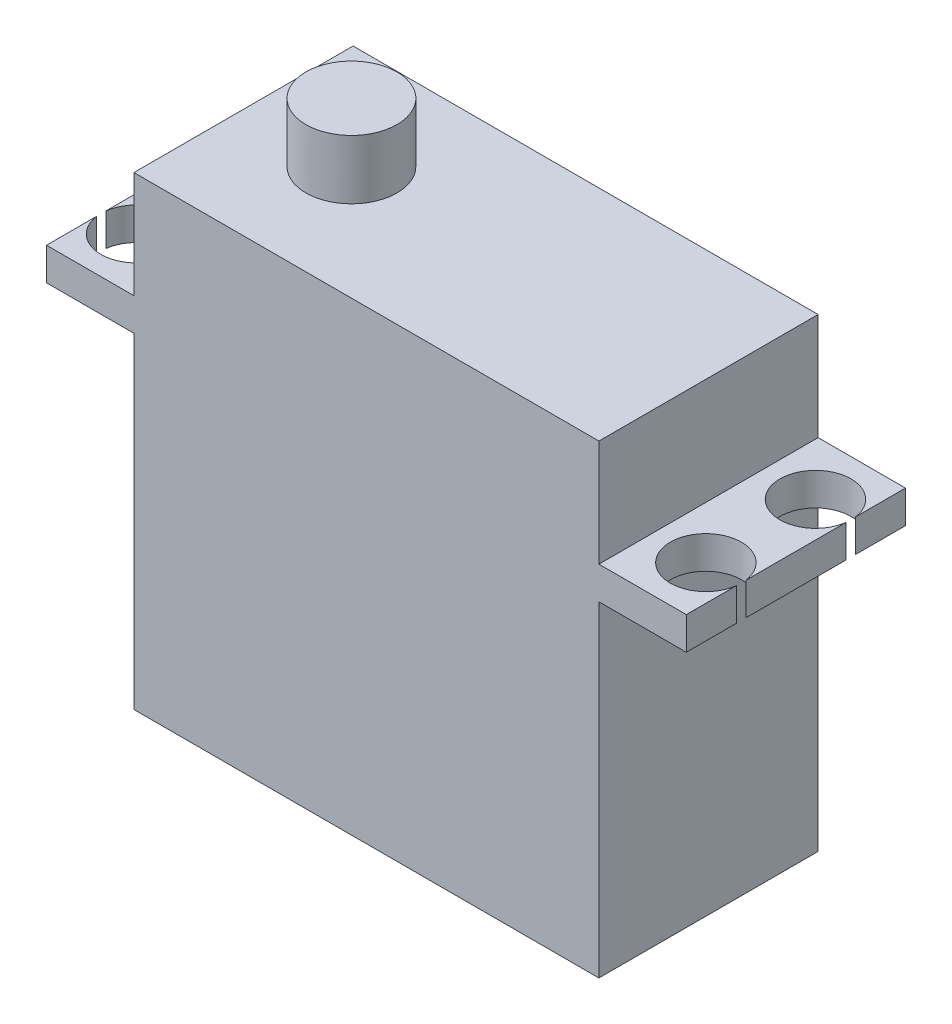
ISO-10303-21;
HEADER;
FILE_DESCRIPTION(('STEP AP214'),'2;1');
FILE_NAME('part.step','',(''),(''),'','','');
FILE_SCHEMA(('AUTOMOTIVE_DESIGN { 1 0 10303 214 1 1 1 1 }'));
ENDSEC;
DATA;
#1=APPLICATION_CONTEXT('core data for automotive mechanical design processes');
#2=APPLICATION_PROTOCOL_DEFINITION('international standard','automotive_design',2000,#1);
#3=PRODUCT_CONTEXT('',#1,'mechanical');
#4=PRODUCT('Part','Part','',(#3));
#5=PRODUCT_RELATED_PRODUCT_CATEGORY('part','',(#4));
#6=PRODUCT_DEFINITION_FORMATION('','',#4);
#7=PRODUCT_DEFINITION_CONTEXT('part definition',#1,'design');
#8=PRODUCT_DEFINITION('design','',#6,#7);
#9=PRODUCT_DEFINITION_SHAPE('','',#8);
#10=(LENGTH_UNIT() NAMED_UNIT(*) SI_UNIT(.MILLI.,.METRE.));
#11=(NAMED_UNIT(*) PLANE_ANGLE_UNIT() SI_UNIT($,.RADIAN.));
#12=(NAMED_UNIT(*) SI_UNIT($,.STERADIAN.) SOLID_ANGLE_UNIT());
#13=UNCERTAINTY_MEASURE_WITH_UNIT(LENGTH_MEASURE(1.E-05),#10,'distance_accuracy_value','');
#14=(GEOMETRIC_REPRESENTATION_CONTEXT(3) GLOBAL_UNCERTAINTY_ASSIGNED_CONTEXT((#13)) GLOBAL_UNIT_ASSIGNED_CONTEXT((#10,
#11,#12)) REPRESENTATION_CONTEXT('',''));
#15=CARTESIAN_POINT('',(0.,0.,0.));
#16=DIRECTION('',(0.,0.,1.));
#17=DIRECTION('',(1.,0.,0.));
#18=AXIS2_PLACEMENT_3D('',#15,#16,#17);
#19=CARTESIAN_POINT('',(-7.493,0.,0.));
#20=DIRECTION('',(1.,0.,0.));
#21=DIRECTION('',(0.,0.,-1.));
#22=AXIS2_PLACEMENT_3D('',#19,#20,#21);
#23=PLANE('',#22);
#24=DIRECTION('',(0.,0.,1.));
#25=VECTOR('',#24,1.);
#26=CARTESIAN_POINT('',(-7.493,27.94,-18.796));
#27=LINE('',#26,#25);
#28=CARTESIAN_POINT('',(-7.493,27.94,-13.6960559769363));
#29=VERTEX_POINT('',#28);
#30=CARTESIAN_POINT('',(-7.493,27.94,-5.09994402306369));
#31=VERTEX_POINT('',#30);
#32=EDGE_CURVE('E235',#29,#31,#27,.T.);
#33=ORIENTED_EDGE('',*,*,#32,.T.);
#34=DIRECTION('',(0.,1.,0.));
#35=VECTOR('',#34,1.);
#36=CARTESIAN_POINT('',(-7.493,25.654,-5.09994402306369));
#37=LINE('',#36,#35);
#38=CARTESIAN_POINT('',(-7.493,30.734,-5.09994402306369));
#39=VERTEX_POINT('',#38);
#40=EDGE_CURVE('E11',#31,#39,#37,.T.);
#41=ORIENTED_EDGE('',*,*,#40,.T.);
#42=DIRECTION('',(0.,0.,-1.));
#43=VECTOR('',#42,1.);
#44=CARTESIAN_POINT('',(-7.493,30.734,-18.796));
#45=LINE('',#44,#43);
#46=CARTESIAN_POINT('',(-7.493,30.734,-13.6960559769363));
#47=VERTEX_POINT('',#46);
#48=EDGE_CURVE('E242',#39,#47,#45,.T.);
#49=ORIENTED_EDGE('',*,*,#48,.T.);
#50=DIRECTION('',(0.,1.,0.));
#51=VECTOR('',#50,1.);
#52=CARTESIAN_POINT('',(-7.493,25.654,-13.6960559769363));
#53=LINE('',#52,#51);
#54=EDGE_CURVE('E301',#47,#29,#53,.F.);
#55=ORIENTED_EDGE('',*,*,#54,.T.);
#56=EDGE_LOOP('',(#33,#41,#49,#55));
#57=FACE_BOUND('',#56,.T.);
#58=ADVANCED_FACE('F36',(#57),#23,.F.);
#59=CARTESIAN_POINT('',(-7.493,27.94,-18.796));
#60=VERTEX_POINT('',#59);
#61=CARTESIAN_POINT('',(-7.493,27.94,-14.4979440230637));
#62=VERTEX_POINT('',#61);
#63=EDGE_CURVE('E231',#60,#62,#27,.T.);
#64=ORIENTED_EDGE('',*,*,#63,.T.);
#65=DIRECTION('',(0.,1.,0.));
#66=VECTOR('',#65,1.);
#67=CARTESIAN_POINT('',(-7.493,25.654,-14.4979440230637));
#68=LINE('',#67,#66);
#69=CARTESIAN_POINT('',(-7.493,30.734,-14.4979440230637));
#70=VERTEX_POINT('',#69);
#71=EDGE_CURVE('E303',#62,#70,#68,.T.);
#72=ORIENTED_EDGE('',*,*,#71,.T.);
#73=CARTESIAN_POINT('',(-7.493,30.734,-18.796));
#74=VERTEX_POINT('',#73);
#75=EDGE_CURVE('E237',#70,#74,#45,.T.);
#76=ORIENTED_EDGE('',*,*,#75,.T.);
#77=DIRECTION('',(0.,-1.,0.));
#78=VECTOR('',#77,1.);
#79=CARTESIAN_POINT('',(-7.493,27.94,-18.796));
#80=LINE('',#79,#78);
#81=EDGE_CURVE('E226',#74,#60,#80,.T.);
#82=ORIENTED_EDGE('',*,*,#81,.T.);
#83=EDGE_LOOP('',(#64,#72,#76,#82));
#84=FACE_BOUND('',#83,.T.);
#85=ADVANCED_FACE('F322',(#84),#23,.F.);
#86=CARTESIAN_POINT('',(47.371,0.,0.));
#87=DIRECTION('',(-1.,0.,0.));
#88=DIRECTION('',(0.,0.,1.));
#89=AXIS2_PLACEMENT_3D('',#86,#87,#88);
#90=PLANE('',#89);
#91=DIRECTION('',(0.,0.,-1.));
#92=VECTOR('',#91,1.);
#93=CARTESIAN_POINT('',(47.371,27.94,0.));
#94=LINE('',#93,#92);
#95=CARTESIAN_POINT('',(47.371,27.94,-5.09994402306371));
#96=VERTEX_POINT('',#95);
#97=CARTESIAN_POINT('',(47.371,27.94,-13.6960559769364));
#98=VERTEX_POINT('',#97);
#99=EDGE_CURVE('E355',#96,#98,#94,.T.);
#100=ORIENTED_EDGE('',*,*,#99,.T.);
#101=DIRECTION('',(0.,1.,0.));
#102=VECTOR('',#101,1.);
#103=CARTESIAN_POINT('',(47.371,25.654,-13.6960559769364));
#104=LINE('',#103,#102);
#105=CARTESIAN_POINT('',(47.371,30.734,-13.6960559769364));
#106=VERTEX_POINT('',#105);
#107=EDGE_CURVE('E298',#98,#106,#104,.T.);
#108=ORIENTED_EDGE('',*,*,#107,.T.);
#109=DIRECTION('',(0.,0.,1.));
#110=VECTOR('',#109,1.);
#111=CARTESIAN_POINT('',(47.371,30.734,0.));
#112=LINE('',#111,#110);
#113=CARTESIAN_POINT('',(47.371,30.734,-5.09994402306371));
#114=VERTEX_POINT('',#113);
#115=EDGE_CURVE('E200',#106,#114,#112,.T.);
#116=ORIENTED_EDGE('',*,*,#115,.T.);
#117=DIRECTION('',(0.,1.,0.));
#118=VECTOR('',#117,1.);
#119=CARTESIAN_POINT('',(47.371,25.654,-5.09994402306371));
#120=LINE('',#119,#118);
#121=EDGE_CURVE('E178',#114,#96,#120,.F.);
#122=ORIENTED_EDGE('',*,*,#121,.T.);
#123=EDGE_LOOP('',(#100,#108,#116,#122));
#124=FACE_BOUND('',#123,.T.);
#125=ADVANCED_FACE('F371',(#124),#90,.F.);
#126=CARTESIAN_POINT('',(47.371,27.94,0.));
#127=VERTEX_POINT('',#126);
#128=CARTESIAN_POINT('',(47.371,27.94,-4.29805597693635));
#129=VERTEX_POINT('',#128);
#130=EDGE_CURVE('E192',#127,#129,#94,.T.);
#131=ORIENTED_EDGE('',*,*,#130,.T.);
#132=DIRECTION('',(0.,1.,0.));
#133=VECTOR('',#132,1.);
#134=CARTESIAN_POINT('',(47.371,25.654,-4.29805597693635));
#135=LINE('',#134,#133);
#136=CARTESIAN_POINT('',(47.371,30.734,-4.29805597693635));
#137=VERTEX_POINT('',#136);
#138=EDGE_CURVE('E175',#129,#137,#135,.T.);
#139=ORIENTED_EDGE('',*,*,#138,.T.);
#140=CARTESIAN_POINT('',(47.371,30.734,0.));
#141=VERTEX_POINT('',#140);
#142=EDGE_CURVE('E190',#137,#141,#112,.T.);
#143=ORIENTED_EDGE('',*,*,#142,.T.);
#144=DIRECTION('',(0.,-1.,0.));
#145=VECTOR('',#144,1.);
#146=CARTESIAN_POINT('',(47.371,27.94,0.));
#147=LINE('',#146,#145);
#148=EDGE_CURVE('E352',#141,#127,#147,.T.);
#149=ORIENTED_EDGE('',*,*,#148,.T.);
#150=EDGE_LOOP('',(#131,#139,#143,#149));
#151=FACE_BOUND('',#150,.T.);
#152=ADVANCED_FACE('F188',(#151),#90,.F.);
#153=CARTESIAN_POINT('',(39.878,39.878,0.));
#154=DIRECTION('',(-1.,0.,0.));
#155=DIRECTION('',(0.,0.,1.));
#156=AXIS2_PLACEMENT_3D('',#153,#154,#155);
#157=PLANE('',#156);
#158=DIRECTION('',(0.,0.,1.));
#159=VECTOR('',#158,1.);
#160=CARTESIAN_POINT('',(39.878,30.734,0.));
#161=LINE('',#160,#159);
#162=CARTESIAN_POINT('',(39.878,30.734,-18.796));
#163=VERTEX_POINT('',#162);
#164=CARTESIAN_POINT('',(39.878,30.734,0.));
#165=VERTEX_POINT('',#164);
#166=EDGE_CURVE('E218',#163,#165,#161,.T.);
#167=ORIENTED_EDGE('',*,*,#166,.F.);
#168=DIRECTION('',(0.,-1.,0.));
#169=VECTOR('',#168,1.);
#170=CARTESIAN_POINT('',(39.878,39.878,-18.796));
#171=LINE('',#170,#169);
#172=CARTESIAN_POINT('',(39.878,39.878,-18.796));
#173=VERTEX_POINT('',#172);
#174=EDGE_CURVE('E283',#173,#163,#171,.T.);
#175=ORIENTED_EDGE('',*,*,#174,.F.);
#176=DIRECTION('',(0.,0.,-1.));
#177=VECTOR('',#176,1.);
#178=CARTESIAN_POINT('',(39.878,39.878,0.));
#179=LINE('',#178,#177);
#180=CARTESIAN_POINT('',(39.878,39.878,0.));
#181=VERTEX_POINT('',#180);
#182=EDGE_CURVE('E265',#181,#173,#179,.T.);
#183=ORIENTED_EDGE('',*,*,#182,.F.);
#184=DIRECTION('',(0.,-1.,0.));
#185=VECTOR('',#184,1.);
#186=CARTESIAN_POINT('',(39.878,39.878,0.));
#187=LINE('',#186,#185);
#188=EDGE_CURVE('E287',#181,#165,#187,.T.);
#189=ORIENTED_EDGE('',*,*,#188,.T.);
#190=EDGE_LOOP('',(#167,#175,#183,#189));
#191=FACE_BOUND('',#190,.T.);
#192=ADVANCED_FACE('F380',(#191),#157,.F.);
#193=DIRECTION('',(0.,0.,-1.));
#194=VECTOR('',#193,1.);
#195=CARTESIAN_POINT('',(39.878,27.94,0.));
#196=LINE('',#195,#194);
#197=CARTESIAN_POINT('',(39.878,27.94,0.));
#198=VERTEX_POINT('',#197);
#199=CARTESIAN_POINT('',(39.878,27.94,-18.796));
#200=VERTEX_POINT('',#199);
#201=EDGE_CURVE('E351',#198,#200,#196,.T.);
#202=ORIENTED_EDGE('',*,*,#201,.F.);
#203=CARTESIAN_POINT('',(39.878,0.,0.));
#204=VERTEX_POINT('',#203);
#205=EDGE_CURVE('E286',#198,#204,#187,.T.);
#206=ORIENTED_EDGE('',*,*,#205,.T.);
#207=DIRECTION('',(0.,0.,-1.));
#208=VECTOR('',#207,1.);
#209=CARTESIAN_POINT('',(39.878,0.,0.));
#210=LINE('',#209,#208);
#211=CARTESIAN_POINT('',(39.878,0.,-18.796));
#212=VERTEX_POINT('',#211);
#213=EDGE_CURVE('E275',#204,#212,#210,.T.);
#214=ORIENTED_EDGE('',*,*,#213,.T.);
#215=EDGE_CURVE('E282',#200,#212,#171,.T.);
#216=ORIENTED_EDGE('',*,*,#215,.F.);
#217=EDGE_LOOP('',(#202,#206,#214,#216));
#218=FACE_BOUND('',#217,.T.);
#219=ADVANCED_FACE('F377',(#218),#157,.F.);
#220=CARTESIAN_POINT('',(0.,39.878,0.));
#221=DIRECTION('',(1.,0.,0.));
#222=DIRECTION('',(0.,0.,-1.));
#223=AXIS2_PLACEMENT_3D('',#220,#221,#222);
#224=PLANE('',#223);
#225=DIRECTION('',(0.,0.,-1.));
#226=VECTOR('',#225,1.);
#227=CARTESIAN_POINT('',(0.,30.734,-18.796));
#228=LINE('',#227,#226);
#229=CARTESIAN_POINT('',(0.,30.734,0.));
#230=VERTEX_POINT('',#229);
#231=CARTESIAN_POINT('',(0.,30.734,-18.796));
#232=VERTEX_POINT('',#231);
#233=EDGE_CURVE('E230',#230,#232,#228,.T.);
#234=ORIENTED_EDGE('',*,*,#233,.F.);
#235=DIRECTION('',(0.,-1.,0.));
#236=VECTOR('',#235,1.);
#237=CARTESIAN_POINT('',(0.,39.878,0.));
#238=LINE('',#237,#236);
#239=CARTESIAN_POINT('',(0.,39.878,0.));
#240=VERTEX_POINT('',#239);
#241=EDGE_CURVE('E290',#240,#230,#238,.T.);
#242=ORIENTED_EDGE('',*,*,#241,.F.);
#243=DIRECTION('',(0.,0.,1.));
#244=VECTOR('',#243,1.);
#245=CARTESIAN_POINT('',(0.,39.878,0.));
#246=LINE('',#245,#244);
#247=CARTESIAN_POINT('',(0.,39.878,-18.796));
#248=VERTEX_POINT('',#247);
#249=EDGE_CURVE('E259',#248,#240,#246,.T.);
#250=ORIENTED_EDGE('',*,*,#249,.F.);
#251=DIRECTION('',(0.,-1.,0.));
#252=VECTOR('',#251,1.);
#253=CARTESIAN_POINT('',(0.,39.878,-18.796));
#254=LINE('',#253,#252);
#255=EDGE_CURVE('E280',#248,#232,#254,.T.);
#256=ORIENTED_EDGE('',*,*,#255,.T.);
#257=EDGE_LOOP('',(#234,#242,#250,#256));
#258=FACE_BOUND('',#257,.T.);
#259=ADVANCED_FACE('F38',(#258),#224,.F.);
#260=DIRECTION('',(0.,0.,1.));
#261=VECTOR('',#260,1.);
#262=CARTESIAN_POINT('',(0.,27.94,-18.796));
#263=LINE('',#262,#261);
#264=CARTESIAN_POINT('',(0.,27.94,-18.796));
#265=VERTEX_POINT('',#264);
#266=CARTESIAN_POINT('',(0.,27.94,0.));
#267=VERTEX_POINT('',#266);
#268=EDGE_CURVE('E225',#265,#267,#263,.T.);
#269=ORIENTED_EDGE('',*,*,#268,.F.);
#270=CARTESIAN_POINT('',(0.,0.,-18.796));
#271=VERTEX_POINT('',#270);
#272=EDGE_CURVE('E269',#265,#271,#254,.T.);
#273=ORIENTED_EDGE('',*,*,#272,.T.);
#274=DIRECTION('',(0.,0.,1.));
#275=VECTOR('',#274,1.);
#276=CARTESIAN_POINT('',(0.,0.,0.));
#277=LINE('',#276,#275);
#278=CARTESIAN_POINT('',(0.,0.,0.));
#279=VERTEX_POINT('',#278);
#280=EDGE_CURVE('E258',#271,#279,#277,.T.);
#281=ORIENTED_EDGE('',*,*,#280,.T.);
#282=EDGE_CURVE('E289',#267,#279,#238,.T.);
#283=ORIENTED_EDGE('',*,*,#282,.F.);
#284=EDGE_LOOP('',(#269,#273,#281,#283));
#285=FACE_BOUND('',#284,.T.);
#286=ADVANCED_FACE('F426',(#285),#224,.F.);
#287=CARTESIAN_POINT('',(0.,39.878,0.));
#288=DIRECTION('',(0.,0.,-1.));
#289=DIRECTION('',(-1.,0.,0.));
#290=AXIS2_PLACEMENT_3D('',#287,#288,#289);
#291=PLANE('',#290);
#292=DIRECTION('',(1.,0.,0.));
#293=VECTOR('',#292,1.);
#294=CARTESIAN_POINT('',(0.,0.,0.));
#295=LINE('',#294,#293);
#296=EDGE_CURVE('E272',#279,#204,#295,.T.);
#297=ORIENTED_EDGE('',*,*,#296,.T.);
#298=ORIENTED_EDGE('',*,*,#205,.F.);
#299=DIRECTION('',(-1.,0.,0.));
#300=VECTOR('',#299,1.);
#301=CARTESIAN_POINT('',(47.371,27.94,0.));
#302=LINE('',#301,#300);
#303=EDGE_CURVE('E222',#127,#198,#302,.T.);
#304=ORIENTED_EDGE('',*,*,#303,.F.);
#305=ORIENTED_EDGE('',*,*,#148,.F.);
#306=DIRECTION('',(-1.,0.,0.));
#307=VECTOR('',#306,1.);
#308=CARTESIAN_POINT('',(47.371,30.734,0.));
#309=LINE('',#308,#307);
#310=EDGE_CURVE('E198',#141,#165,#309,.T.);
#311=ORIENTED_EDGE('',*,*,#310,.T.);
#312=ORIENTED_EDGE('',*,*,#188,.F.);
#313=DIRECTION('',(1.,0.,0.));
#314=VECTOR('',#313,1.);
#315=CARTESIAN_POINT('',(0.,39.878,0.));
#316=LINE('',#315,#314);
#317=EDGE_CURVE('E262',#240,#181,#316,.T.);
#318=ORIENTED_EDGE('',*,*,#317,.F.);
#319=ORIENTED_EDGE('',*,*,#241,.T.);
#320=DIRECTION('',(1.,0.,0.));
#321=VECTOR('',#320,1.);
#322=CARTESIAN_POINT('',(-7.493,30.734,0.));
#323=LINE('',#322,#321);
#324=CARTESIAN_POINT('',(-7.493,30.734,0.));
#325=VERTEX_POINT('',#324);
#326=EDGE_CURVE('E249',#325,#230,#323,.T.);
#327=ORIENTED_EDGE('',*,*,#326,.F.);
#328=DIRECTION('',(0.,1.,0.));
#329=VECTOR('',#328,1.);
#330=CARTESIAN_POINT('',(-7.493,27.94,0.));
#331=LINE('',#330,#329);
#332=CARTESIAN_POINT('',(-7.493,27.94,0.));
#333=VERTEX_POINT('',#332);
#334=EDGE_CURVE('E234',#333,#325,#331,.T.);
#335=ORIENTED_EDGE('',*,*,#334,.F.);
#336=DIRECTION('',(1.,0.,0.));
#337=VECTOR('',#336,1.);
#338=CARTESIAN_POINT('',(-7.493,27.94,0.));
#339=LINE('',#338,#337);
#340=EDGE_CURVE('E252',#333,#267,#339,.T.);
#341=ORIENTED_EDGE('',*,*,#340,.T.);
#342=ORIENTED_EDGE('',*,*,#282,.T.);
#343=EDGE_LOOP('',(#297,#298,#304,#305,#311,#312,#318,#319,#327,#335,#341,#342));
#344=FACE_BOUND('',#343,.T.);
#345=ADVANCED_FACE('F331',(#344),#291,.F.);
#346=CARTESIAN_POINT('',(0.,39.878,-18.796));
#347=DIRECTION('',(0.,0.,1.));
#348=DIRECTION('',(1.,0.,0.));
#349=AXIS2_PLACEMENT_3D('',#346,#347,#348);
#350=PLANE('',#349);
#351=DIRECTION('',(-1.,0.,0.));
#352=VECTOR('',#351,1.);
#353=CARTESIAN_POINT('',(0.,0.,-18.796));
#354=LINE('',#353,#352);
#355=EDGE_CURVE('E263',#212,#271,#354,.T.);
#356=ORIENTED_EDGE('',*,*,#355,.T.);
#357=ORIENTED_EDGE('',*,*,#272,.F.);
#358=DIRECTION('',(1.,0.,0.));
#359=VECTOR('',#358,1.);
#360=CARTESIAN_POINT('',(-7.493,27.94,-18.796));
#361=LINE('',#360,#359);
#362=EDGE_CURVE('E255',#60,#265,#361,.T.);
#363=ORIENTED_EDGE('',*,*,#362,.F.);
#364=ORIENTED_EDGE('',*,*,#81,.F.);
#365=DIRECTION('',(1.,0.,0.));
#366=VECTOR('',#365,1.);
#367=CARTESIAN_POINT('',(-7.493,30.734,-18.796));
#368=LINE('',#367,#366);
#369=EDGE_CURVE('E241',#74,#232,#368,.T.);
#370=ORIENTED_EDGE('',*,*,#369,.T.);
#371=ORIENTED_EDGE('',*,*,#255,.F.);
#372=DIRECTION('',(-1.,0.,0.));
#373=VECTOR('',#372,1.);
#374=CARTESIAN_POINT('',(0.,39.878,-18.796));
#375=LINE('',#374,#373);
#376=EDGE_CURVE('E267',#173,#248,#375,.T.);
#377=ORIENTED_EDGE('',*,*,#376,.F.);
#378=ORIENTED_EDGE('',*,*,#174,.T.);
#379=DIRECTION('',(-1.,0.,0.));
#380=VECTOR('',#379,1.);
#381=CARTESIAN_POINT('',(47.371,30.734,-18.796));
#382=LINE('',#381,#380);
#383=CARTESIAN_POINT('',(47.371,30.734,-18.796));
#384=VERTEX_POINT('',#383);
#385=EDGE_CURVE('E210',#384,#163,#382,.T.);
#386=ORIENTED_EDGE('',*,*,#385,.F.);
#387=DIRECTION('',(0.,1.,0.));
#388=VECTOR('',#387,1.);
#389=CARTESIAN_POINT('',(47.371,27.94,-18.796));
#390=LINE('',#389,#388);
#391=CARTESIAN_POINT('',(47.371,27.94,-18.796));
#392=VERTEX_POINT('',#391);
#393=EDGE_CURVE('E201',#392,#384,#390,.T.);
#394=ORIENTED_EDGE('',*,*,#393,.F.);
#395=DIRECTION('',(-1.,0.,0.));
#396=VECTOR('',#395,1.);
#397=CARTESIAN_POINT('',(47.371,27.94,-18.796));
#398=LINE('',#397,#396);
#399=EDGE_CURVE('E215',#392,#200,#398,.T.);
#400=ORIENTED_EDGE('',*,*,#399,.T.);
#401=ORIENTED_EDGE('',*,*,#215,.T.);
#402=EDGE_LOOP('',(#356,#357,#363,#364,#370,#371,#377,#378,#386,#394,#400,#401));
#403=FACE_BOUND('',#402,.T.);
#404=ADVANCED_FACE('F329',(#403),#350,.F.);
#405=CARTESIAN_POINT('',(0.,39.878,0.));
#406=DIRECTION('',(0.,-1.,0.));
#407=DIRECTION('',(0.,0.,-1.));
#408=AXIS2_PLACEMENT_3D('',#405,#406,#407);
#409=PLANE('',#408);
#410=CARTESIAN_POINT('',(8.89,39.878,-9.7647570607622));
#411=DIRECTION('',(0.,-1.,0.));
#412=DIRECTION('',(0.,0.,-1.));
#413=AXIS2_PLACEMENT_3D('',#410,#411,#412);
#414=CIRCLE('',#413,3.90808302264822);
#415=CARTESIAN_POINT('',(8.89,39.878,-13.6728400834104));
#416=VERTEX_POINT('',#415);
#417=EDGE_CURVE('E293',#416,#416,#414,.F.);
#418=ORIENTED_EDGE('',*,*,#417,.F.);
#419=EDGE_LOOP('',(#418));
#420=FACE_BOUND('',#419,.T.);
#421=ORIENTED_EDGE('',*,*,#249,.T.);
#422=ORIENTED_EDGE('',*,*,#317,.T.);
#423=ORIENTED_EDGE('',*,*,#182,.T.);
#424=ORIENTED_EDGE('',*,*,#376,.T.);
#425=EDGE_LOOP('',(#421,#422,#423,#424));
#426=FACE_BOUND('',#425,.T.);
#427=ADVANCED_FACE('F384',(#420,#426),#409,.F.);
#428=CARTESIAN_POINT('',(0.,0.,0.));
#429=DIRECTION('',(0.,-1.,0.));
#430=DIRECTION('',(0.,0.,-1.));
#431=AXIS2_PLACEMENT_3D('',#428,#429,#430);
#432=PLANE('',#431);
#433=ORIENTED_EDGE('',*,*,#280,.F.);
#434=ORIENTED_EDGE('',*,*,#355,.F.);
#435=ORIENTED_EDGE('',*,*,#213,.F.);
#436=ORIENTED_EDGE('',*,*,#296,.F.);
#437=EDGE_LOOP('',(#433,#434,#435,#436));
#438=FACE_BOUND('',#437,.T.);
#439=ADVANCED_FACE('F413',(#438),#432,.T.);
#440=CARTESIAN_POINT('',(-7.493,27.94,-18.796));
#441=DIRECTION('',(0.,1.,0.));
#442=DIRECTION('',(0.,0.,1.));
#443=AXIS2_PLACEMENT_3D('',#440,#441,#442);
#444=PLANE('',#443);
#445=CARTESIAN_POINT('',(-7.493,27.94,-4.29805597693631));
#446=VERTEX_POINT('',#445);
#447=EDGE_CURVE('E229',#446,#333,#27,.T.);
#448=ORIENTED_EDGE('',*,*,#447,.F.);
#449=CARTESIAN_POINT('',(-4.4714858282031,27.94,-4.699));
#450=DIRECTION('',(0.,1.,0.));
#451=DIRECTION('',(0.,0.,1.));
#452=AXIS2_PLACEMENT_3D('',#449,#450,#451);
#453=CIRCLE('',#452,3.048);
#454=EDGE_CURVE('E51',#446,#31,#453,.T.);
#455=ORIENTED_EDGE('',*,*,#454,.T.);
#456=ORIENTED_EDGE('',*,*,#32,.F.);
#457=CARTESIAN_POINT('',(-4.4714858282031,27.94,-14.097));
#458=DIRECTION('',(0.,1.,0.));
#459=DIRECTION('',(0.,0.,1.));
#460=AXIS2_PLACEMENT_3D('',#457,#458,#459);
#461=CIRCLE('',#460,3.048);
#462=EDGE_CURVE('E59',#29,#62,#461,.T.);
#463=ORIENTED_EDGE('',*,*,#462,.T.);
#464=ORIENTED_EDGE('',*,*,#63,.F.);
#465=ORIENTED_EDGE('',*,*,#362,.T.);
#466=ORIENTED_EDGE('',*,*,#268,.T.);
#467=ORIENTED_EDGE('',*,*,#340,.F.);
#468=EDGE_LOOP('',(#448,#455,#456,#463,#464,#465,#466,#467));
#469=FACE_BOUND('',#468,.T.);
#470=ADVANCED_FACE('F312',(#469),#444,.F.);
#471=CARTESIAN_POINT('',(-7.493,30.734,-18.796));
#472=DIRECTION('',(0.,-1.,0.));
#473=DIRECTION('',(0.,0.,-1.));
#474=AXIS2_PLACEMENT_3D('',#471,#472,#473);
#475=PLANE('',#474);
#476=ORIENTED_EDGE('',*,*,#48,.F.);
#477=CARTESIAN_POINT('',(-4.4714858282031,30.734,-4.699));
#478=DIRECTION('',(0.,1.,0.));
#479=DIRECTION('',(0.,0.,-1.));
#480=AXIS2_PLACEMENT_3D('',#477,#478,#479);
#481=CIRCLE('',#480,3.048);
#482=CARTESIAN_POINT('',(-7.493,30.734,-4.29805597693631));
#483=VERTEX_POINT('',#482);
#484=EDGE_CURVE('E183',#483,#39,#481,.T.);
#485=ORIENTED_EDGE('',*,*,#484,.F.);
#486=EDGE_CURVE('E238',#325,#483,#45,.T.);
#487=ORIENTED_EDGE('',*,*,#486,.F.);
#488=ORIENTED_EDGE('',*,*,#326,.T.);
#489=ORIENTED_EDGE('',*,*,#233,.T.);
#490=ORIENTED_EDGE('',*,*,#369,.F.);
#491=ORIENTED_EDGE('',*,*,#75,.F.);
#492=CARTESIAN_POINT('',(-4.4714858282031,30.734,-14.097));
#493=DIRECTION('',(0.,1.,0.));
#494=DIRECTION('',(0.,0.,1.));
#495=AXIS2_PLACEMENT_3D('',#492,#493,#494);
#496=CIRCLE('',#495,3.048);
#497=EDGE_CURVE('E338',#47,#70,#496,.T.);
#498=ORIENTED_EDGE('',*,*,#497,.F.);
#499=EDGE_LOOP('',(#476,#485,#487,#488,#489,#490,#491,#498));
#500=FACE_BOUND('',#499,.T.);
#501=ADVANCED_FACE('F336',(#500),#475,.F.);
#502=ORIENTED_EDGE('',*,*,#486,.T.);
#503=DIRECTION('',(0.,1.,0.));
#504=VECTOR('',#503,1.);
#505=CARTESIAN_POINT('',(-7.493,25.654,-4.29805597693631));
#506=LINE('',#505,#504);
#507=EDGE_CURVE('E44',#483,#446,#506,.F.);
#508=ORIENTED_EDGE('',*,*,#507,.T.);
#509=ORIENTED_EDGE('',*,*,#447,.T.);
#510=ORIENTED_EDGE('',*,*,#334,.T.);
#511=EDGE_LOOP('',(#502,#508,#509,#510));
#512=FACE_BOUND('',#511,.T.);
#513=ADVANCED_FACE('F307',(#512),#23,.F.);
#514=CARTESIAN_POINT('',(47.371,27.94,0.));
#515=DIRECTION('',(0.,1.,0.));
#516=DIRECTION('',(0.,0.,1.));
#517=AXIS2_PLACEMENT_3D('',#514,#515,#516);
#518=PLANE('',#517);
#519=CARTESIAN_POINT('',(47.371,27.94,-14.4979440230636));
#520=VERTEX_POINT('',#519);
#521=EDGE_CURVE('E354',#520,#392,#94,.T.);
#522=ORIENTED_EDGE('',*,*,#521,.F.);
#523=CARTESIAN_POINT('',(44.3494858282031,27.94,-14.097));
#524=DIRECTION('',(0.,1.,0.));
#525=DIRECTION('',(0.,0.,1.));
#526=AXIS2_PLACEMENT_3D('',#523,#524,#525);
#527=CIRCLE('',#526,3.048);
#528=EDGE_CURVE('E319',#520,#98,#527,.T.);
#529=ORIENTED_EDGE('',*,*,#528,.T.);
#530=ORIENTED_EDGE('',*,*,#99,.F.);
#531=CARTESIAN_POINT('',(44.3494858282031,27.94,-4.69900000000003));
#532=DIRECTION('',(0.,1.,0.));
#533=DIRECTION('',(0.,0.,1.));
#534=AXIS2_PLACEMENT_3D('',#531,#532,#533);
#535=CIRCLE('',#534,3.048);
#536=EDGE_CURVE('E340',#96,#129,#535,.T.);
#537=ORIENTED_EDGE('',*,*,#536,.T.);
#538=ORIENTED_EDGE('',*,*,#130,.F.);
#539=ORIENTED_EDGE('',*,*,#303,.T.);
#540=ORIENTED_EDGE('',*,*,#201,.T.);
#541=ORIENTED_EDGE('',*,*,#399,.F.);
#542=EDGE_LOOP('',(#522,#529,#530,#537,#538,#539,#540,#541));
#543=FACE_BOUND('',#542,.T.);
#544=ADVANCED_FACE('F364',(#543),#518,.F.);
#545=CARTESIAN_POINT('',(47.371,30.734,0.));
#546=DIRECTION('',(0.,-1.,0.));
#547=DIRECTION('',(0.,0.,-1.));
#548=AXIS2_PLACEMENT_3D('',#545,#546,#547);
#549=PLANE('',#548);
#550=ORIENTED_EDGE('',*,*,#115,.F.);
#551=CARTESIAN_POINT('',(44.3494858282031,30.734,-14.097));
#552=DIRECTION('',(0.,1.,0.));
#553=DIRECTION('',(0.,0.,-1.));
#554=AXIS2_PLACEMENT_3D('',#551,#552,#553);
#555=CIRCLE('',#554,3.048);
#556=CARTESIAN_POINT('',(47.371,30.734,-14.4979440230636));
#557=VERTEX_POINT('',#556);
#558=EDGE_CURVE('E184',#557,#106,#555,.T.);
#559=ORIENTED_EDGE('',*,*,#558,.F.);
#560=EDGE_CURVE('E203',#384,#557,#112,.T.);
#561=ORIENTED_EDGE('',*,*,#560,.F.);
#562=ORIENTED_EDGE('',*,*,#385,.T.);
#563=ORIENTED_EDGE('',*,*,#166,.T.);
#564=ORIENTED_EDGE('',*,*,#310,.F.);
#565=ORIENTED_EDGE('',*,*,#142,.F.);
#566=CARTESIAN_POINT('',(44.3494858282031,30.734,-4.69900000000003));
#567=DIRECTION('',(0.,1.,0.));
#568=DIRECTION('',(0.,0.,1.));
#569=AXIS2_PLACEMENT_3D('',#566,#567,#568);
#570=CIRCLE('',#569,3.048);
#571=EDGE_CURVE('E172',#114,#137,#570,.T.);
#572=ORIENTED_EDGE('',*,*,#571,.F.);
#573=EDGE_LOOP('',(#550,#559,#561,#562,#563,#564,#565,#572));
#574=FACE_BOUND('',#573,.T.);
#575=ADVANCED_FACE('F195',(#574),#549,.F.);
#576=ORIENTED_EDGE('',*,*,#560,.T.);
#577=DIRECTION('',(0.,1.,0.));
#578=VECTOR('',#577,1.);
#579=CARTESIAN_POINT('',(47.371,25.654,-14.4979440230636));
#580=LINE('',#579,#578);
#581=EDGE_CURVE('E193',#557,#520,#580,.F.);
#582=ORIENTED_EDGE('',*,*,#581,.T.);
#583=ORIENTED_EDGE('',*,*,#521,.T.);
#584=ORIENTED_EDGE('',*,*,#393,.T.);
#585=EDGE_LOOP('',(#576,#582,#583,#584));
#586=FACE_BOUND('',#585,.T.);
#587=ADVANCED_FACE('F359',(#586),#90,.F.);
#588=CARTESIAN_POINT('',(8.89,44.958,-9.7647570607622));
#589=DIRECTION('',(0.,-1.,0.));
#590=DIRECTION('',(0.,0.,-1.));
#591=AXIS2_PLACEMENT_3D('',#588,#589,#590);
#592=CYLINDRICAL_SURFACE('',#591,3.90808302264822);
#593=CARTESIAN_POINT('',(8.89,44.958,-9.7647570607622));
#594=DIRECTION('',(0.,1.,0.));
#595=DIRECTION('',(0.,0.,1.));
#596=AXIS2_PLACEMENT_3D('',#593,#594,#595);
#597=CIRCLE('',#596,3.90808302264822);
#598=CARTESIAN_POINT('',(8.89,44.958,-5.85667403811398));
#599=VERTEX_POINT('',#598);
#600=EDGE_CURVE('E348',#599,#599,#597,.T.);
#601=ORIENTED_EDGE('',*,*,#600,.F.);
#602=EDGE_LOOP('',(#601));
#603=FACE_BOUND('',#602,.T.);
#604=ORIENTED_EDGE('',*,*,#417,.T.);
#605=EDGE_LOOP('',(#604));
#606=FACE_BOUND('',#605,.T.);
#607=ADVANCED_FACE('F473',(#603,#606),#592,.T.);
#608=CARTESIAN_POINT('',(8.89,44.958,-9.7647570607622));
#609=DIRECTION('',(0.,1.,0.));
#610=DIRECTION('',(0.,0.,1.));
#611=AXIS2_PLACEMENT_3D('',#608,#609,#610);
#612=PLANE('',#611);
#613=ORIENTED_EDGE('',*,*,#600,.T.);
#614=EDGE_LOOP('',(#613));
#615=FACE_BOUND('',#614,.T.);
#616=ADVANCED_FACE('F468',(#615),#612,.T.);
#617=CARTESIAN_POINT('',(44.3494858282031,25.654,-4.69900000000003));
#618=DIRECTION('',(0.,1.,0.));
#619=DIRECTION('',(0.,0.,1.));
#620=AXIS2_PLACEMENT_3D('',#617,#618,#619);
#621=CYLINDRICAL_SURFACE('',#620,3.048);
#622=ORIENTED_EDGE('',*,*,#536,.F.);
#623=ORIENTED_EDGE('',*,*,#121,.F.);
#624=ORIENTED_EDGE('',*,*,#571,.T.);
#625=ORIENTED_EDGE('',*,*,#138,.F.);
#626=EDGE_LOOP('',(#622,#623,#624,#625));
#627=FACE_BOUND('',#626,.T.);
#628=ADVANCED_FACE('F174',(#627),#621,.F.);
#629=CARTESIAN_POINT('',(44.3494858282031,25.654,-14.097));
#630=DIRECTION('',(0.,1.,0.));
#631=DIRECTION('',(0.,0.,1.));
#632=AXIS2_PLACEMENT_3D('',#629,#630,#631);
#633=CYLINDRICAL_SURFACE('',#632,3.048);
#634=ORIENTED_EDGE('',*,*,#528,.F.);
#635=ORIENTED_EDGE('',*,*,#581,.F.);
#636=ORIENTED_EDGE('',*,*,#558,.T.);
#637=ORIENTED_EDGE('',*,*,#107,.F.);
#638=EDGE_LOOP('',(#634,#635,#636,#637));
#639=FACE_BOUND('',#638,.T.);
#640=ADVANCED_FACE('F369',(#639),#633,.F.);
#641=CARTESIAN_POINT('',(-4.4714858282031,25.654,-14.097));
#642=DIRECTION('',(0.,1.,0.));
#643=DIRECTION('',(0.,0.,1.));
#644=AXIS2_PLACEMENT_3D('',#641,#642,#643);
#645=CYLINDRICAL_SURFACE('',#644,3.048);
#646=ORIENTED_EDGE('',*,*,#462,.F.);
#647=ORIENTED_EDGE('',*,*,#54,.F.);
#648=ORIENTED_EDGE('',*,*,#497,.T.);
#649=ORIENTED_EDGE('',*,*,#71,.F.);
#650=EDGE_LOOP('',(#646,#647,#648,#649));
#651=FACE_BOUND('',#650,.T.);
#652=ADVANCED_FACE('F387',(#651),#645,.F.);
#653=CARTESIAN_POINT('',(-4.4714858282031,25.654,-4.699));
#654=DIRECTION('',(0.,1.,0.));
#655=DIRECTION('',(0.,0.,1.));
#656=AXIS2_PLACEMENT_3D('',#653,#654,#655);
#657=CYLINDRICAL_SURFACE('',#656,3.048);
#658=ORIENTED_EDGE('',*,*,#454,.F.);
#659=ORIENTED_EDGE('',*,*,#507,.F.);
#660=ORIENTED_EDGE('',*,*,#484,.T.);
#661=ORIENTED_EDGE('',*,*,#40,.F.);
#662=EDGE_LOOP('',(#658,#659,#660,#661));
#663=FACE_BOUND('',#662,.T.);
#664=ADVANCED_FACE('F389',(#663),#657,.F.);
#665=CLOSED_SHELL('',(#58,#85,#125,#152,#192,#219,#259,#286,#345,#404,#427,#439,#470,#501,#513,
#544,#575,#587,#607,#616,#628,#640,#652,#664));
#666=MANIFOLD_SOLID_BREP('B2',#665);
#667=ADVANCED_BREP_SHAPE_REPRESENTATION('',(#18,#666),#14);
#668=SHAPE_DEFINITION_REPRESENTATION(#9,#667);
ENDSEC;
END-ISO-10303-21;
